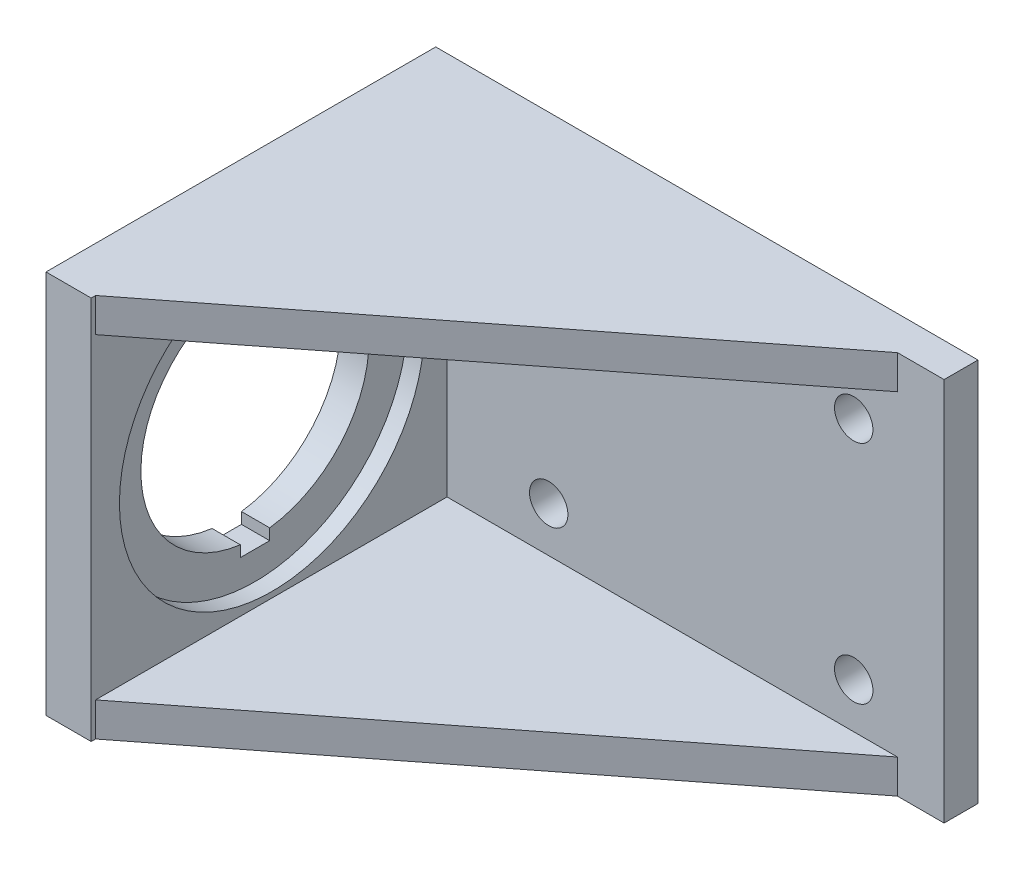
ISO-10303-21;
HEADER;
FILE_DESCRIPTION(('STEP AP214'),'2;1');
FILE_NAME('part.step','',(''),(''),'','','');
FILE_SCHEMA(('AUTOMOTIVE_DESIGN { 1 0 10303 214 1 1 1 1 }'));
ENDSEC;
DATA;
#1=APPLICATION_CONTEXT('core data for automotive mechanical design processes');
#2=APPLICATION_PROTOCOL_DEFINITION('international standard','automotive_design',2000,#1);
#3=PRODUCT_CONTEXT('',#1,'mechanical');
#4=PRODUCT('Part','Part','',(#3));
#5=PRODUCT_RELATED_PRODUCT_CATEGORY('part','',(#4));
#6=PRODUCT_DEFINITION_FORMATION('','',#4);
#7=PRODUCT_DEFINITION_CONTEXT('part definition',#1,'design');
#8=PRODUCT_DEFINITION('design','',#6,#7);
#9=PRODUCT_DEFINITION_SHAPE('','',#8);
#10=(LENGTH_UNIT() NAMED_UNIT(*) SI_UNIT(.MILLI.,.METRE.));
#11=(NAMED_UNIT(*) PLANE_ANGLE_UNIT() SI_UNIT($,.RADIAN.));
#12=(NAMED_UNIT(*) SI_UNIT($,.STERADIAN.) SOLID_ANGLE_UNIT());
#13=UNCERTAINTY_MEASURE_WITH_UNIT(LENGTH_MEASURE(1.E-05),#10,'distance_accuracy_value','');
#14=(GEOMETRIC_REPRESENTATION_CONTEXT(3) GLOBAL_UNCERTAINTY_ASSIGNED_CONTEXT((#13)) GLOBAL_UNIT_ASSIGNED_CONTEXT((#10,
#11,#12)) REPRESENTATION_CONTEXT('',''));
#15=CARTESIAN_POINT('',(0.,0.,0.));
#16=DIRECTION('',(0.,0.,1.));
#17=DIRECTION('',(1.,0.,0.));
#18=AXIS2_PLACEMENT_3D('',#15,#16,#17);
#19=CARTESIAN_POINT('',(-201.5,-45.,200.));
#20=DIRECTION('',(-1.,0.,0.));
#21=DIRECTION('',(0.,0.,1.));
#22=AXIS2_PLACEMENT_3D('',#19,#20,#21);
#23=PLANE('',#22);
#24=DIRECTION('',(0.,1.,0.));
#25=VECTOR('',#24,1.);
#26=CARTESIAN_POINT('',(-201.5,-50.5,198.7));
#27=LINE('',#26,#25);
#28=CARTESIAN_POINT('',(-201.5,-56.,198.7));
#29=VERTEX_POINT('',#28);
#30=CARTESIAN_POINT('',(-201.5,-55.01598722043,198.7));
#31=VERTEX_POINT('',#30);
#32=EDGE_CURVE('E194',#29,#31,#27,.T.);
#33=ORIENTED_EDGE('',*,*,#32,.F.);
#34=DIRECTION('',(0.,0.,-1.));
#35=VECTOR('',#34,1.);
#36=CARTESIAN_POINT('',(-201.5,-56.,199.35));
#37=LINE('',#36,#35);
#38=CARTESIAN_POINT('',(-201.5,-56.,201.3));
#39=VERTEX_POINT('',#38);
#40=EDGE_CURVE('E225',#39,#29,#37,.T.);
#41=ORIENTED_EDGE('',*,*,#40,.F.);
#42=DIRECTION('',(0.,1.,0.));
#43=VECTOR('',#42,1.);
#44=CARTESIAN_POINT('',(-201.5,-50.5,201.3));
#45=LINE('',#44,#43);
#46=CARTESIAN_POINT('',(-201.5,-55.01598722043,201.3));
#47=VERTEX_POINT('',#46);
#48=EDGE_CURVE('E279',#39,#47,#45,.T.);
#49=ORIENTED_EDGE('',*,*,#48,.T.);
#50=CARTESIAN_POINT('',(-201.5,-45.,200.));
#51=DIRECTION('',(1.,0.,0.));
#52=DIRECTION('',(0.,-0.991681903013796,-0.128712871286973));
#53=AXIS2_PLACEMENT_3D('',#50,#51,#52);
#54=CIRCLE('',#53,10.1);
#55=EDGE_CURVE('E372',#31,#47,#54,.T.);
#56=ORIENTED_EDGE('',*,*,#55,.F.);
#57=EDGE_LOOP('',(#33,#41,#49,#56));
#58=FACE_BOUND('',#57,.T.);
#59=CARTESIAN_POINT('',(-201.5,-45.,200.));
#60=DIRECTION('',(-1.,0.,0.));
#61=DIRECTION('',(0.,0.,1.));
#62=AXIS2_PLACEMENT_3D('',#59,#60,#61);
#63=CIRCLE('',#62,13.5);
#64=CARTESIAN_POINT('',(-201.5,-45.,213.5));
#65=VERTEX_POINT('',#64);
#66=EDGE_CURVE('E39',#65,#65,#63,.T.);
#67=ORIENTED_EDGE('',*,*,#66,.F.);
#68=EDGE_LOOP('',(#67));
#69=FACE_BOUND('',#68,.T.);
#70=ADVANCED_FACE('F14',(#58,#69),#23,.F.);
#71=CARTESIAN_POINT('',(-191.,-35.,181.4));
#72=DIRECTION('',(0.,0.,1.));
#73=DIRECTION('',(0.,1.,0.));
#74=AXIS2_PLACEMENT_3D('',#71,#72,#73);
#75=CYLINDRICAL_SURFACE('',#74,1.7);
#76=DIRECTION('',(0.,0.,1.));
#77=VECTOR('',#76,1.);
#78=CARTESIAN_POINT('',(-191.,-33.3,181.4));
#79=LINE('',#78,#77);
#80=CARTESIAN_POINT('',(-191.,-33.3,181.5));
#81=VERTEX_POINT('',#80);
#82=CARTESIAN_POINT('',(-191.,-33.3,184.5));
#83=VERTEX_POINT('',#82);
#84=EDGE_CURVE('E9',#81,#83,#79,.T.);
#85=ORIENTED_EDGE('',*,*,#84,.F.);
#86=CARTESIAN_POINT('',(-191.,-35.,181.5));
#87=DIRECTION('',(0.,0.,1.));
#88=DIRECTION('',(0.,1.,0.));
#89=AXIS2_PLACEMENT_3D('',#86,#87,#88);
#90=CIRCLE('',#89,1.7);
#91=EDGE_CURVE('E356',#81,#81,#90,.T.);
#92=ORIENTED_EDGE('',*,*,#91,.F.);
#93=ORIENTED_EDGE('',*,*,#84,.T.);
#94=CARTESIAN_POINT('',(-191.,-35.,184.5));
#95=DIRECTION('',(0.,0.,1.));
#96=DIRECTION('',(0.,1.,0.));
#97=AXIS2_PLACEMENT_3D('',#94,#95,#96);
#98=CIRCLE('',#97,1.7);
#99=EDGE_CURVE('E307',#83,#83,#98,.T.);
#100=ORIENTED_EDGE('',*,*,#99,.T.);
#101=EDGE_LOOP('',(#85,#92,#93,#100));
#102=FACE_BOUND('',#101,.T.);
#103=ADVANCED_FACE('F515',(#102),#75,.F.);
#104=CARTESIAN_POINT('',(-191.,-55.,181.4));
#105=DIRECTION('',(0.,0.,1.));
#106=DIRECTION('',(0.,1.,0.));
#107=AXIS2_PLACEMENT_3D('',#104,#105,#106);
#108=CYLINDRICAL_SURFACE('',#107,1.7);
#109=DIRECTION('',(0.,0.,1.));
#110=VECTOR('',#109,1.);
#111=CARTESIAN_POINT('',(-191.,-53.3,181.4));
#112=LINE('',#111,#110);
#113=CARTESIAN_POINT('',(-191.,-53.3,181.5));
#114=VERTEX_POINT('',#113);
#115=CARTESIAN_POINT('',(-191.,-53.3,184.5));
#116=VERTEX_POINT('',#115);
#117=EDGE_CURVE('E25',#114,#116,#112,.T.);
#118=ORIENTED_EDGE('',*,*,#117,.F.);
#119=CARTESIAN_POINT('',(-191.,-55.,181.5));
#120=DIRECTION('',(0.,0.,1.));
#121=DIRECTION('',(0.,1.,0.));
#122=AXIS2_PLACEMENT_3D('',#119,#120,#121);
#123=CIRCLE('',#122,1.7);
#124=EDGE_CURVE('E352',#114,#114,#123,.T.);
#125=ORIENTED_EDGE('',*,*,#124,.F.);
#126=ORIENTED_EDGE('',*,*,#117,.T.);
#127=CARTESIAN_POINT('',(-191.,-55.,184.5));
#128=DIRECTION('',(0.,0.,1.));
#129=DIRECTION('',(0.,1.,0.));
#130=AXIS2_PLACEMENT_3D('',#127,#128,#129);
#131=CIRCLE('',#130,1.7);
#132=EDGE_CURVE('E312',#116,#116,#131,.T.);
#133=ORIENTED_EDGE('',*,*,#132,.T.);
#134=EDGE_LOOP('',(#118,#125,#126,#133));
#135=FACE_BOUND('',#134,.T.);
#136=ADVANCED_FACE('F521',(#135),#108,.F.);
#137=CARTESIAN_POINT('',(-164.,-35.,181.4));
#138=DIRECTION('',(0.,0.,1.));
#139=DIRECTION('',(0.,1.,0.));
#140=AXIS2_PLACEMENT_3D('',#137,#138,#139);
#141=CYLINDRICAL_SURFACE('',#140,1.7);
#142=DIRECTION('',(0.,0.,1.));
#143=VECTOR('',#142,1.);
#144=CARTESIAN_POINT('',(-164.,-33.3,181.4));
#145=LINE('',#144,#143);
#146=CARTESIAN_POINT('',(-164.,-33.3,181.5));
#147=VERTEX_POINT('',#146);
#148=CARTESIAN_POINT('',(-164.,-33.3,184.5));
#149=VERTEX_POINT('',#148);
#150=EDGE_CURVE('E300',#147,#149,#145,.T.);
#151=ORIENTED_EDGE('',*,*,#150,.F.);
#152=CARTESIAN_POINT('',(-164.,-35.,181.5));
#153=DIRECTION('',(0.,0.,1.));
#154=DIRECTION('',(0.,1.,0.));
#155=AXIS2_PLACEMENT_3D('',#152,#153,#154);
#156=CIRCLE('',#155,1.7);
#157=EDGE_CURVE('E243',#147,#147,#156,.T.);
#158=ORIENTED_EDGE('',*,*,#157,.F.);
#159=ORIENTED_EDGE('',*,*,#150,.T.);
#160=CARTESIAN_POINT('',(-164.,-35.,184.5));
#161=DIRECTION('',(0.,0.,1.));
#162=DIRECTION('',(0.,1.,0.));
#163=AXIS2_PLACEMENT_3D('',#160,#161,#162);
#164=CIRCLE('',#163,1.7);
#165=EDGE_CURVE('E316',#149,#149,#164,.T.);
#166=ORIENTED_EDGE('',*,*,#165,.T.);
#167=EDGE_LOOP('',(#151,#158,#159,#166));
#168=FACE_BOUND('',#167,.T.);
#169=ADVANCED_FACE('F551',(#168),#141,.F.);
#170=CARTESIAN_POINT('',(-164.,-55.,181.4));
#171=DIRECTION('',(0.,0.,1.));
#172=DIRECTION('',(0.,1.,0.));
#173=AXIS2_PLACEMENT_3D('',#170,#171,#172);
#174=CYLINDRICAL_SURFACE('',#173,1.7);
#175=DIRECTION('',(0.,0.,1.));
#176=VECTOR('',#175,1.);
#177=CARTESIAN_POINT('',(-164.,-53.3,181.4));
#178=LINE('',#177,#176);
#179=CARTESIAN_POINT('',(-164.,-53.3,181.5));
#180=VERTEX_POINT('',#179);
#181=CARTESIAN_POINT('',(-164.,-53.3,184.5));
#182=VERTEX_POINT('',#181);
#183=EDGE_CURVE('E350',#180,#182,#178,.T.);
#184=ORIENTED_EDGE('',*,*,#183,.F.);
#185=CARTESIAN_POINT('',(-164.,-55.,181.5));
#186=DIRECTION('',(0.,0.,1.));
#187=DIRECTION('',(0.,1.,0.));
#188=AXIS2_PLACEMENT_3D('',#185,#186,#187);
#189=CIRCLE('',#188,1.7);
#190=EDGE_CURVE('E239',#180,#180,#189,.T.);
#191=ORIENTED_EDGE('',*,*,#190,.F.);
#192=ORIENTED_EDGE('',*,*,#183,.T.);
#193=CARTESIAN_POINT('',(-164.,-55.,184.5));
#194=DIRECTION('',(0.,0.,1.));
#195=DIRECTION('',(0.,1.,0.));
#196=AXIS2_PLACEMENT_3D('',#193,#194,#195);
#197=CIRCLE('',#196,1.7);
#198=EDGE_CURVE('E18',#182,#182,#197,.T.);
#199=ORIENTED_EDGE('',*,*,#198,.T.);
#200=EDGE_LOOP('',(#184,#191,#192,#199));
#201=FACE_BOUND('',#200,.T.);
#202=ADVANCED_FACE('F537',(#201),#174,.F.);
#203=CARTESIAN_POINT('',(-199.9,-45.,200.));
#204=DIRECTION('',(-1.,0.,0.));
#205=DIRECTION('',(0.,0.,1.));
#206=AXIS2_PLACEMENT_3D('',#203,#204,#205);
#207=CYLINDRICAL_SURFACE('',#206,13.5);
#208=CARTESIAN_POINT('',(-200.,-45.,200.));
#209=DIRECTION('',(-1.,0.,0.));
#210=DIRECTION('',(0.,0.,1.));
#211=AXIS2_PLACEMENT_3D('',#208,#209,#210);
#212=CIRCLE('',#211,13.5);
#213=CARTESIAN_POINT('',(-200.,-45.,213.5));
#214=VERTEX_POINT('',#213);
#215=EDGE_CURVE('E235',#214,#214,#212,.T.);
#216=ORIENTED_EDGE('',*,*,#215,.F.);
#217=DIRECTION('',(-1.,0.,0.));
#218=VECTOR('',#217,1.);
#219=CARTESIAN_POINT('',(-199.9,-45.,213.5));
#220=LINE('',#219,#218);
#221=EDGE_CURVE('E193',#214,#65,#220,.T.);
#222=ORIENTED_EDGE('',*,*,#221,.T.);
#223=ORIENTED_EDGE('',*,*,#66,.T.);
#224=ORIENTED_EDGE('',*,*,#221,.F.);
#225=EDGE_LOOP('',(#216,#222,#223,#224));
#226=FACE_BOUND('',#225,.T.);
#227=ADVANCED_FACE('F534',(#226),#207,.F.);
#228=CARTESIAN_POINT('',(-185.4326627905,-59.,195.0173372094));
#229=DIRECTION('',(0.,1.,0.));
#230=DIRECTION('',(1.,0.,0.));
#231=AXIS2_PLACEMENT_3D('',#228,#229,#230);
#232=PLANE('',#231);
#233=DIRECTION('',(0.,0.,-1.));
#234=VECTOR('',#233,1.);
#235=CARTESIAN_POINT('',(-200.,-59.,188.2586686047));
#236=LINE('',#235,#234);
#237=CARTESIAN_POINT('',(-200.,-59.,215.60987654321));
#238=VERTEX_POINT('',#237);
#239=CARTESIAN_POINT('',(-200.,-59.,184.5));
#240=VERTEX_POINT('',#239);
#241=EDGE_CURVE('E215',#238,#240,#236,.T.);
#242=ORIENTED_EDGE('',*,*,#241,.F.);
#243=DIRECTION('',(0.788407891407103,0.,-0.61515282391208));
#244=VECTOR('',#243,1.);
#245=CARTESIAN_POINT('',(-200.5,-59.,216.));
#246=LINE('',#245,#244);
#247=CARTESIAN_POINT('',(-160.1281645569,-59.,184.5));
#248=VERTEX_POINT('',#247);
#249=EDGE_CURVE('E234',#238,#248,#246,.T.);
#250=ORIENTED_EDGE('',*,*,#249,.T.);
#251=DIRECTION('',(-1.,0.,0.));
#252=VECTOR('',#251,1.);
#253=CARTESIAN_POINT('',(-170.7163313952,-59.,184.5));
#254=LINE('',#253,#252);
#255=EDGE_CURVE('E339',#248,#240,#254,.T.);
#256=ORIENTED_EDGE('',*,*,#255,.T.);
#257=EDGE_LOOP('',(#242,#250,#256));
#258=FACE_BOUND('',#257,.T.);
#259=ADVANCED_FACE('F437',(#258),#232,.T.);
#260=CARTESIAN_POINT('',(-185.4326627905,-31.,195.0173372094));
#261=DIRECTION('',(0.,1.,0.));
#262=DIRECTION('',(1.,0.,0.));
#263=AXIS2_PLACEMENT_3D('',#260,#261,#262);
#264=PLANE('',#263);
#265=DIRECTION('',(-1.,0.,0.));
#266=VECTOR('',#265,1.);
#267=CARTESIAN_POINT('',(-170.7163313952,-31.,184.5));
#268=LINE('',#267,#266);
#269=CARTESIAN_POINT('',(-160.1281645569,-31.,184.5));
#270=VERTEX_POINT('',#269);
#271=CARTESIAN_POINT('',(-200.,-31.,184.5));
#272=VERTEX_POINT('',#271);
#273=EDGE_CURVE('E188',#270,#272,#268,.T.);
#274=ORIENTED_EDGE('',*,*,#273,.F.);
#275=DIRECTION('',(0.788407891407103,0.,-0.61515282391208));
#276=VECTOR('',#275,1.);
#277=CARTESIAN_POINT('',(-200.5,-31.,216.));
#278=LINE('',#277,#276);
#279=CARTESIAN_POINT('',(-200.,-31.,215.60987654321));
#280=VERTEX_POINT('',#279);
#281=EDGE_CURVE('E182',#280,#270,#278,.T.);
#282=ORIENTED_EDGE('',*,*,#281,.F.);
#283=DIRECTION('',(0.,0.,-1.));
#284=VECTOR('',#283,1.);
#285=CARTESIAN_POINT('',(-200.,-31.,188.2586686047));
#286=LINE('',#285,#284);
#287=EDGE_CURVE('E186',#280,#272,#286,.T.);
#288=ORIENTED_EDGE('',*,*,#287,.T.);
#289=EDGE_LOOP('',(#274,#282,#288));
#290=FACE_BOUND('',#289,.T.);
#291=ADVANCED_FACE('F184',(#290),#264,.F.);
#292=CARTESIAN_POINT('',(-200.5,-31.,216.));
#293=DIRECTION('',(-0.61515282391208,0.,-0.788407891407103));
#294=DIRECTION('',(-0.788407891407103,0.,0.61515282391208));
#295=AXIS2_PLACEMENT_3D('',#292,#293,#294);
#296=PLANE('',#295);
#297=DIRECTION('',(0.,-1.,0.));
#298=VECTOR('',#297,1.);
#299=CARTESIAN_POINT('',(-160.1281645569,-46.5,184.5));
#300=LINE('',#299,#298);
#301=CARTESIAN_POINT('',(-160.1281645569,-28.,184.5));
#302=VERTEX_POINT('',#301);
#303=EDGE_CURVE('E245',#302,#270,#300,.T.);
#304=ORIENTED_EDGE('',*,*,#303,.F.);
#305=DIRECTION('',(0.788407891407103,0.,-0.61515282391208));
#306=VECTOR('',#305,1.);
#307=CARTESIAN_POINT('',(-200.5,-28.,216.));
#308=LINE('',#307,#306);
#309=CARTESIAN_POINT('',(-200.,-28.,215.60987654321));
#310=VERTEX_POINT('',#309);
#311=EDGE_CURVE('E199',#310,#302,#308,.T.);
#312=ORIENTED_EDGE('',*,*,#311,.F.);
#313=DIRECTION('',(0.,-1.,0.));
#314=VECTOR('',#313,1.);
#315=CARTESIAN_POINT('',(-200.,-46.5,215.60987654321));
#316=LINE('',#315,#314);
#317=EDGE_CURVE('E197',#310,#280,#316,.T.);
#318=ORIENTED_EDGE('',*,*,#317,.T.);
#319=ORIENTED_EDGE('',*,*,#281,.T.);
#320=EDGE_LOOP('',(#304,#312,#318,#319));
#321=FACE_BOUND('',#320,.T.);
#322=ADVANCED_FACE('F198',(#321),#296,.F.);
#323=CARTESIAN_POINT('',(-201.4,-56.,198.7));
#324=DIRECTION('',(0.,0.,1.));
#325=DIRECTION('',(1.,0.,0.));
#326=AXIS2_PLACEMENT_3D('',#323,#324,#325);
#327=PLANE('',#326);
#328=DIRECTION('',(-1.,0.,0.));
#329=VECTOR('',#328,1.);
#330=CARTESIAN_POINT('',(-201.4,-56.,198.7));
#331=LINE('',#330,#329);
#332=CARTESIAN_POINT('',(-204.,-56.,198.7));
#333=VERTEX_POINT('',#332);
#334=EDGE_CURVE('E221',#29,#333,#331,.T.);
#335=ORIENTED_EDGE('',*,*,#334,.F.);
#336=ORIENTED_EDGE('',*,*,#32,.T.);
#337=DIRECTION('',(-1.,0.,0.));
#338=VECTOR('',#337,1.);
#339=CARTESIAN_POINT('',(-199.9,-55.01598722043,198.7));
#340=LINE('',#339,#338);
#341=CARTESIAN_POINT('',(-204.,-55.01598722043,198.7));
#342=VERTEX_POINT('',#341);
#343=EDGE_CURVE('E369',#31,#342,#340,.T.);
#344=ORIENTED_EDGE('',*,*,#343,.T.);
#345=DIRECTION('',(0.,1.,0.));
#346=VECTOR('',#345,1.);
#347=CARTESIAN_POINT('',(-204.,-59.,198.7));
#348=LINE('',#347,#346);
#349=EDGE_CURVE('E254',#333,#342,#348,.T.);
#350=ORIENTED_EDGE('',*,*,#349,.F.);
#351=EDGE_LOOP('',(#335,#336,#344,#350));
#352=FACE_BOUND('',#351,.T.);
#353=ADVANCED_FACE('F412',(#352),#327,.T.);
#354=CARTESIAN_POINT('',(-201.4,-56.,198.7));
#355=DIRECTION('',(0.,1.,0.));
#356=DIRECTION('',(1.,0.,0.));
#357=AXIS2_PLACEMENT_3D('',#354,#355,#356);
#358=PLANE('',#357);
#359=DIRECTION('',(-1.,0.,0.));
#360=VECTOR('',#359,1.);
#361=CARTESIAN_POINT('',(-201.4,-56.,201.3));
#362=LINE('',#361,#360);
#363=CARTESIAN_POINT('',(-204.,-56.,201.3));
#364=VERTEX_POINT('',#363);
#365=EDGE_CURVE('E264',#39,#364,#362,.T.);
#366=ORIENTED_EDGE('',*,*,#365,.F.);
#367=ORIENTED_EDGE('',*,*,#40,.T.);
#368=ORIENTED_EDGE('',*,*,#334,.T.);
#369=DIRECTION('',(0.,0.,-1.));
#370=VECTOR('',#369,1.);
#371=CARTESIAN_POINT('',(-204.,-56.,190.1));
#372=LINE('',#371,#370);
#373=EDGE_CURVE('E268',#364,#333,#372,.T.);
#374=ORIENTED_EDGE('',*,*,#373,.F.);
#375=EDGE_LOOP('',(#366,#367,#368,#374));
#376=FACE_BOUND('',#375,.T.);
#377=ADVANCED_FACE('F586',(#376),#358,.T.);
#378=CARTESIAN_POINT('',(-201.4,-56.,201.3));
#379=DIRECTION('',(0.,0.,1.));
#380=DIRECTION('',(1.,0.,0.));
#381=AXIS2_PLACEMENT_3D('',#378,#379,#380);
#382=PLANE('',#381);
#383=DIRECTION('',(0.,1.,0.));
#384=VECTOR('',#383,1.);
#385=CARTESIAN_POINT('',(-204.,-59.,201.3));
#386=LINE('',#385,#384);
#387=CARTESIAN_POINT('',(-204.,-55.01598722043,201.3));
#388=VERTEX_POINT('',#387);
#389=EDGE_CURVE('E265',#364,#388,#386,.T.);
#390=ORIENTED_EDGE('',*,*,#389,.T.);
#391=DIRECTION('',(-1.,0.,0.));
#392=VECTOR('',#391,1.);
#393=CARTESIAN_POINT('',(-199.9,-55.01598722043,201.3));
#394=LINE('',#393,#392);
#395=EDGE_CURVE('E283',#47,#388,#394,.T.);
#396=ORIENTED_EDGE('',*,*,#395,.F.);
#397=ORIENTED_EDGE('',*,*,#48,.F.);
#398=ORIENTED_EDGE('',*,*,#365,.T.);
#399=EDGE_LOOP('',(#390,#396,#397,#398));
#400=FACE_BOUND('',#399,.T.);
#401=ADVANCED_FACE('F403',(#400),#382,.F.);
#402=CARTESIAN_POINT('',(-199.9,-45.,200.));
#403=DIRECTION('',(-1.,0.,0.));
#404=DIRECTION('',(0.,0.,1.));
#405=AXIS2_PLACEMENT_3D('',#402,#403,#404);
#406=CYLINDRICAL_SURFACE('',#405,10.1);
#407=ORIENTED_EDGE('',*,*,#343,.F.);
#408=ORIENTED_EDGE('',*,*,#55,.T.);
#409=ORIENTED_EDGE('',*,*,#395,.T.);
#410=CARTESIAN_POINT('',(-204.,-45.,200.));
#411=DIRECTION('',(1.,0.,0.));
#412=DIRECTION('',(0.,-0.991681903013796,-0.128712871286973));
#413=AXIS2_PLACEMENT_3D('',#410,#411,#412);
#414=CIRCLE('',#413,10.1);
#415=EDGE_CURVE('E269',#342,#388,#414,.T.);
#416=ORIENTED_EDGE('',*,*,#415,.F.);
#417=EDGE_LOOP('',(#407,#408,#409,#416));
#418=FACE_BOUND('',#417,.T.);
#419=ADVANCED_FACE('F398',(#418),#406,.F.);
#420=CARTESIAN_POINT('',(-200.,-28.,181.5));
#421=DIRECTION('',(0.,1.,0.));
#422=DIRECTION('',(1.,0.,0.));
#423=AXIS2_PLACEMENT_3D('',#420,#421,#422);
#424=PLANE('',#423);
#425=DIRECTION('',(0.,0.,-1.));
#426=VECTOR('',#425,1.);
#427=CARTESIAN_POINT('',(-204.,-28.,216.));
#428=LINE('',#427,#426);
#429=CARTESIAN_POINT('',(-204.,-28.,216.));
#430=VERTEX_POINT('',#429);
#431=CARTESIAN_POINT('',(-204.,-28.,181.5));
#432=VERTEX_POINT('',#431);
#433=EDGE_CURVE('E271',#430,#432,#428,.T.);
#434=ORIENTED_EDGE('',*,*,#433,.F.);
#435=DIRECTION('',(-1.,0.,0.));
#436=VECTOR('',#435,1.);
#437=CARTESIAN_POINT('',(-200.,-28.,216.));
#438=LINE('',#437,#436);
#439=CARTESIAN_POINT('',(-200.5,-28.,216.));
#440=VERTEX_POINT('',#439);
#441=EDGE_CURVE('E218',#440,#430,#438,.T.);
#442=ORIENTED_EDGE('',*,*,#441,.F.);
#443=DIRECTION('',(-1.,0.,0.));
#444=VECTOR('',#443,1.);
#445=CARTESIAN_POINT('',(-200.,-28.,216.));
#446=LINE('',#445,#444);
#447=CARTESIAN_POINT('',(-200.,-28.,216.));
#448=VERTEX_POINT('',#447);
#449=EDGE_CURVE('E253',#448,#440,#446,.T.);
#450=ORIENTED_EDGE('',*,*,#449,.F.);
#451=DIRECTION('',(0.,0.,1.));
#452=VECTOR('',#451,1.);
#453=CARTESIAN_POINT('',(-200.,-28.,181.5));
#454=LINE('',#453,#452);
#455=EDGE_CURVE('E203',#310,#448,#454,.T.);
#456=ORIENTED_EDGE('',*,*,#455,.F.);
#457=ORIENTED_EDGE('',*,*,#311,.T.);
#458=DIRECTION('',(-1.,0.,0.));
#459=VECTOR('',#458,1.);
#460=CARTESIAN_POINT('',(-156.,-28.,184.5));
#461=LINE('',#460,#459);
#462=CARTESIAN_POINT('',(-156.,-28.,184.5));
#463=VERTEX_POINT('',#462);
#464=EDGE_CURVE('E248',#463,#302,#461,.T.);
#465=ORIENTED_EDGE('',*,*,#464,.F.);
#466=DIRECTION('',(0.,0.,1.));
#467=VECTOR('',#466,1.);
#468=CARTESIAN_POINT('',(-156.,-28.,181.5));
#469=LINE('',#468,#467);
#470=CARTESIAN_POINT('',(-156.,-28.,181.5));
#471=VERTEX_POINT('',#470);
#472=EDGE_CURVE('E303',#471,#463,#469,.T.);
#473=ORIENTED_EDGE('',*,*,#472,.F.);
#474=DIRECTION('',(1.,0.,0.));
#475=VECTOR('',#474,1.);
#476=CARTESIAN_POINT('',(-204.,-28.,181.5));
#477=LINE('',#476,#475);
#478=EDGE_CURVE('E244',#432,#471,#477,.T.);
#479=ORIENTED_EDGE('',*,*,#478,.F.);
#480=EDGE_LOOP('',(#434,#442,#450,#456,#457,#465,#473,#479));
#481=FACE_BOUND('',#480,.T.);
#482=ADVANCED_FACE('F16',(#481),#424,.T.);
#483=CARTESIAN_POINT('',(-200.,-62.,181.5));
#484=DIRECTION('',(0.,0.,1.));
#485=DIRECTION('',(1.,0.,0.));
#486=AXIS2_PLACEMENT_3D('',#483,#484,#485);
#487=PLANE('',#486);
#488=ORIENTED_EDGE('',*,*,#91,.T.);
#489=EDGE_LOOP('',(#488));
#490=FACE_BOUND('',#489,.T.);
#491=ORIENTED_EDGE('',*,*,#124,.T.);
#492=EDGE_LOOP('',(#491));
#493=FACE_BOUND('',#492,.T.);
#494=ORIENTED_EDGE('',*,*,#157,.T.);
#495=EDGE_LOOP('',(#494));
#496=FACE_BOUND('',#495,.T.);
#497=ORIENTED_EDGE('',*,*,#190,.T.);
#498=EDGE_LOOP('',(#497));
#499=FACE_BOUND('',#498,.T.);
#500=DIRECTION('',(0.,1.,0.));
#501=VECTOR('',#500,1.);
#502=CARTESIAN_POINT('',(-204.,-62.,181.5));
#503=LINE('',#502,#501);
#504=CARTESIAN_POINT('',(-204.,-62.,181.5));
#505=VERTEX_POINT('',#504);
#506=EDGE_CURVE('E294',#505,#432,#503,.T.);
#507=ORIENTED_EDGE('',*,*,#506,.T.);
#508=ORIENTED_EDGE('',*,*,#478,.T.);
#509=DIRECTION('',(0.,1.,0.));
#510=VECTOR('',#509,1.);
#511=CARTESIAN_POINT('',(-156.,-62.,181.5));
#512=LINE('',#511,#510);
#513=CARTESIAN_POINT('',(-156.,-62.,181.5));
#514=VERTEX_POINT('',#513);
#515=EDGE_CURVE('E306',#514,#471,#512,.T.);
#516=ORIENTED_EDGE('',*,*,#515,.F.);
#517=DIRECTION('',(1.,0.,0.));
#518=VECTOR('',#517,1.);
#519=CARTESIAN_POINT('',(-204.,-62.,181.5));
#520=LINE('',#519,#518);
#521=EDGE_CURVE('E226',#505,#514,#520,.T.);
#522=ORIENTED_EDGE('',*,*,#521,.F.);
#523=EDGE_LOOP('',(#507,#508,#516,#522));
#524=FACE_BOUND('',#523,.T.);
#525=ADVANCED_FACE('F462',(#490,#493,#496,#499,#524),#487,.F.);
#526=CARTESIAN_POINT('',(-156.,-62.,181.5));
#527=DIRECTION('',(-1.,0.,0.));
#528=DIRECTION('',(0.,0.,1.));
#529=AXIS2_PLACEMENT_3D('',#526,#527,#528);
#530=PLANE('',#529);
#531=ORIENTED_EDGE('',*,*,#472,.T.);
#532=DIRECTION('',(0.,1.,0.));
#533=VECTOR('',#532,1.);
#534=CARTESIAN_POINT('',(-156.,-62.,184.5));
#535=LINE('',#534,#533);
#536=CARTESIAN_POINT('',(-156.,-62.,184.5));
#537=VERTEX_POINT('',#536);
#538=EDGE_CURVE('E284',#537,#463,#535,.T.);
#539=ORIENTED_EDGE('',*,*,#538,.F.);
#540=DIRECTION('',(0.,0.,1.));
#541=VECTOR('',#540,1.);
#542=CARTESIAN_POINT('',(-156.,-62.,181.5));
#543=LINE('',#542,#541);
#544=EDGE_CURVE('E230',#514,#537,#543,.T.);
#545=ORIENTED_EDGE('',*,*,#544,.F.);
#546=ORIENTED_EDGE('',*,*,#515,.T.);
#547=EDGE_LOOP('',(#531,#539,#545,#546));
#548=FACE_BOUND('',#547,.T.);
#549=ADVANCED_FACE('F465',(#548),#530,.F.);
#550=CARTESIAN_POINT('',(-156.,-62.,184.5));
#551=DIRECTION('',(0.,0.,1.));
#552=DIRECTION('',(1.,0.,0.));
#553=AXIS2_PLACEMENT_3D('',#550,#551,#552);
#554=PLANE('',#553);
#555=ORIENTED_EDGE('',*,*,#99,.F.);
#556=EDGE_LOOP('',(#555));
#557=FACE_BOUND('',#556,.T.);
#558=ORIENTED_EDGE('',*,*,#132,.F.);
#559=EDGE_LOOP('',(#558));
#560=FACE_BOUND('',#559,.T.);
#561=ORIENTED_EDGE('',*,*,#165,.F.);
#562=EDGE_LOOP('',(#561));
#563=FACE_BOUND('',#562,.T.);
#564=ORIENTED_EDGE('',*,*,#198,.F.);
#565=EDGE_LOOP('',(#564));
#566=FACE_BOUND('',#565,.T.);
#567=DIRECTION('',(-1.,0.,0.));
#568=VECTOR('',#567,1.);
#569=CARTESIAN_POINT('',(-156.,-62.,184.5));
#570=LINE('',#569,#568);
#571=CARTESIAN_POINT('',(-160.1281645569,-62.,184.5));
#572=VERTEX_POINT('',#571);
#573=EDGE_CURVE('E311',#537,#572,#570,.T.);
#574=ORIENTED_EDGE('',*,*,#573,.F.);
#575=ORIENTED_EDGE('',*,*,#538,.T.);
#576=ORIENTED_EDGE('',*,*,#464,.T.);
#577=ORIENTED_EDGE('',*,*,#303,.T.);
#578=ORIENTED_EDGE('',*,*,#273,.T.);
#579=DIRECTION('',(0.,1.,0.));
#580=VECTOR('',#579,1.);
#581=CARTESIAN_POINT('',(-200.,-62.,184.5));
#582=LINE('',#581,#580);
#583=EDGE_CURVE('E209',#240,#272,#582,.T.);
#584=ORIENTED_EDGE('',*,*,#583,.F.);
#585=ORIENTED_EDGE('',*,*,#255,.F.);
#586=DIRECTION('',(0.,-1.,0.));
#587=VECTOR('',#586,1.);
#588=CARTESIAN_POINT('',(-160.1281645569,-62.,184.5));
#589=LINE('',#588,#587);
#590=EDGE_CURVE('E231',#248,#572,#589,.T.);
#591=ORIENTED_EDGE('',*,*,#590,.T.);
#592=EDGE_LOOP('',(#574,#575,#576,#577,#578,#584,#585,#591));
#593=FACE_BOUND('',#592,.T.);
#594=ADVANCED_FACE('F439',(#557,#560,#563,#566,#593),#554,.T.);
#595=CARTESIAN_POINT('',(-200.5,-62.,216.));
#596=DIRECTION('',(-0.61515282391208,0.,-0.788407891407103));
#597=DIRECTION('',(-0.788407891407103,0.,0.61515282391208));
#598=AXIS2_PLACEMENT_3D('',#595,#596,#597);
#599=PLANE('',#598);
#600=ORIENTED_EDGE('',*,*,#590,.F.);
#601=ORIENTED_EDGE('',*,*,#249,.F.);
#602=DIRECTION('',(0.,-1.,0.));
#603=VECTOR('',#602,1.);
#604=CARTESIAN_POINT('',(-200.,-62.,215.60987654321));
#605=LINE('',#604,#603);
#606=CARTESIAN_POINT('',(-200.,-62.,215.60987654321));
#607=VERTEX_POINT('',#606);
#608=EDGE_CURVE('E236',#238,#607,#605,.T.);
#609=ORIENTED_EDGE('',*,*,#608,.T.);
#610=DIRECTION('',(0.788407891407103,0.,-0.61515282391208));
#611=VECTOR('',#610,1.);
#612=CARTESIAN_POINT('',(-200.5,-62.,216.));
#613=LINE('',#612,#611);
#614=EDGE_CURVE('E357',#607,#572,#613,.T.);
#615=ORIENTED_EDGE('',*,*,#614,.T.);
#616=EDGE_LOOP('',(#600,#601,#609,#615));
#617=FACE_BOUND('',#616,.T.);
#618=ADVANCED_FACE('F434',(#617),#599,.F.);
#619=CARTESIAN_POINT('',(-200.,-62.,181.5));
#620=DIRECTION('',(-1.,0.,0.));
#621=DIRECTION('',(0.,0.,1.));
#622=AXIS2_PLACEMENT_3D('',#619,#620,#621);
#623=PLANE('',#622);
#624=ORIENTED_EDGE('',*,*,#215,.T.);
#625=EDGE_LOOP('',(#624));
#626=FACE_BOUND('',#625,.T.);
#627=DIRECTION('',(0.,1.,0.));
#628=VECTOR('',#627,1.);
#629=CARTESIAN_POINT('',(-200.,-62.,216.));
#630=LINE('',#629,#628);
#631=CARTESIAN_POINT('',(-200.,-62.,216.));
#632=VERTEX_POINT('',#631);
#633=EDGE_CURVE('E249',#632,#448,#630,.T.);
#634=ORIENTED_EDGE('',*,*,#633,.F.);
#635=DIRECTION('',(0.,0.,1.));
#636=VECTOR('',#635,1.);
#637=CARTESIAN_POINT('',(-200.,-62.,181.5));
#638=LINE('',#637,#636);
#639=EDGE_CURVE('E347',#607,#632,#638,.T.);
#640=ORIENTED_EDGE('',*,*,#639,.F.);
#641=ORIENTED_EDGE('',*,*,#608,.F.);
#642=ORIENTED_EDGE('',*,*,#241,.T.);
#643=ORIENTED_EDGE('',*,*,#583,.T.);
#644=ORIENTED_EDGE('',*,*,#287,.F.);
#645=ORIENTED_EDGE('',*,*,#317,.F.);
#646=ORIENTED_EDGE('',*,*,#455,.T.);
#647=EDGE_LOOP('',(#634,#640,#641,#642,#643,#644,#645,#646));
#648=FACE_BOUND('',#647,.T.);
#649=ADVANCED_FACE('F206',(#626,#648),#623,.F.);
#650=CARTESIAN_POINT('',(-200.,-62.,216.));
#651=DIRECTION('',(0.,0.,1.));
#652=DIRECTION('',(1.,0.,0.));
#653=AXIS2_PLACEMENT_3D('',#650,#651,#652);
#654=PLANE('',#653);
#655=DIRECTION('',(-1.,0.,0.));
#656=VECTOR('',#655,1.);
#657=CARTESIAN_POINT('',(-200.,-62.,216.));
#658=LINE('',#657,#656);
#659=CARTESIAN_POINT('',(-200.5,-62.,216.));
#660=VERTEX_POINT('',#659);
#661=EDGE_CURVE('E260',#632,#660,#658,.T.);
#662=ORIENTED_EDGE('',*,*,#661,.F.);
#663=ORIENTED_EDGE('',*,*,#633,.T.);
#664=ORIENTED_EDGE('',*,*,#449,.T.);
#665=ORIENTED_EDGE('',*,*,#441,.T.);
#666=DIRECTION('',(0.,1.,0.));
#667=VECTOR('',#666,1.);
#668=CARTESIAN_POINT('',(-204.,-62.,216.));
#669=LINE('',#668,#667);
#670=CARTESIAN_POINT('',(-204.,-62.,216.));
#671=VERTEX_POINT('',#670);
#672=EDGE_CURVE('E275',#671,#430,#669,.T.);
#673=ORIENTED_EDGE('',*,*,#672,.F.);
#674=DIRECTION('',(-1.,0.,0.));
#675=VECTOR('',#674,1.);
#676=CARTESIAN_POINT('',(-200.,-62.,216.));
#677=LINE('',#676,#675);
#678=EDGE_CURVE('E255',#660,#671,#677,.T.);
#679=ORIENTED_EDGE('',*,*,#678,.F.);
#680=EDGE_LOOP('',(#662,#663,#664,#665,#673,#679));
#681=FACE_BOUND('',#680,.T.);
#682=ADVANCED_FACE('F428',(#681),#654,.T.);
#683=CARTESIAN_POINT('',(-204.,-62.,181.5));
#684=DIRECTION('',(-1.,0.,0.));
#685=DIRECTION('',(0.,0.,1.));
#686=AXIS2_PLACEMENT_3D('',#683,#684,#685);
#687=PLANE('',#686);
#688=ORIENTED_EDGE('',*,*,#415,.T.);
#689=ORIENTED_EDGE('',*,*,#389,.F.);
#690=ORIENTED_EDGE('',*,*,#373,.T.);
#691=ORIENTED_EDGE('',*,*,#349,.T.);
#692=EDGE_LOOP('',(#688,#689,#690,#691));
#693=FACE_BOUND('',#692,.T.);
#694=ORIENTED_EDGE('',*,*,#506,.F.);
#695=DIRECTION('',(0.,0.,-1.));
#696=VECTOR('',#695,1.);
#697=CARTESIAN_POINT('',(-204.,-62.,216.));
#698=LINE('',#697,#696);
#699=EDGE_CURVE('E259',#671,#505,#698,.T.);
#700=ORIENTED_EDGE('',*,*,#699,.F.);
#701=ORIENTED_EDGE('',*,*,#672,.T.);
#702=ORIENTED_EDGE('',*,*,#433,.T.);
#703=EDGE_LOOP('',(#694,#700,#701,#702));
#704=FACE_BOUND('',#703,.T.);
#705=ADVANCED_FACE('F407',(#693,#704),#687,.T.);
#706=CARTESIAN_POINT('',(-200.,-62.,181.5));
#707=DIRECTION('',(0.,1.,0.));
#708=DIRECTION('',(1.,0.,0.));
#709=AXIS2_PLACEMENT_3D('',#706,#707,#708);
#710=PLANE('',#709);
#711=ORIENTED_EDGE('',*,*,#521,.T.);
#712=ORIENTED_EDGE('',*,*,#544,.T.);
#713=ORIENTED_EDGE('',*,*,#573,.T.);
#714=ORIENTED_EDGE('',*,*,#614,.F.);
#715=ORIENTED_EDGE('',*,*,#639,.T.);
#716=ORIENTED_EDGE('',*,*,#661,.T.);
#717=ORIENTED_EDGE('',*,*,#678,.T.);
#718=ORIENTED_EDGE('',*,*,#699,.T.);
#719=EDGE_LOOP('',(#711,#712,#713,#714,#715,#716,#717,#718));
#720=FACE_BOUND('',#719,.T.);
#721=ADVANCED_FACE('F430',(#720),#710,.F.);
#722=CLOSED_SHELL('',(#70,#103,#136,#169,#202,#227,#259,#291,#322,#353,#377,#401,#419,#482,#525,
#549,#594,#618,#649,#682,#705,#721));
#723=MANIFOLD_SOLID_BREP('B1',#722);
#724=ADVANCED_BREP_SHAPE_REPRESENTATION('',(#18,#723),#14);
#725=SHAPE_DEFINITION_REPRESENTATION(#9,#724);
ENDSEC;
END-ISO-10303-21;
